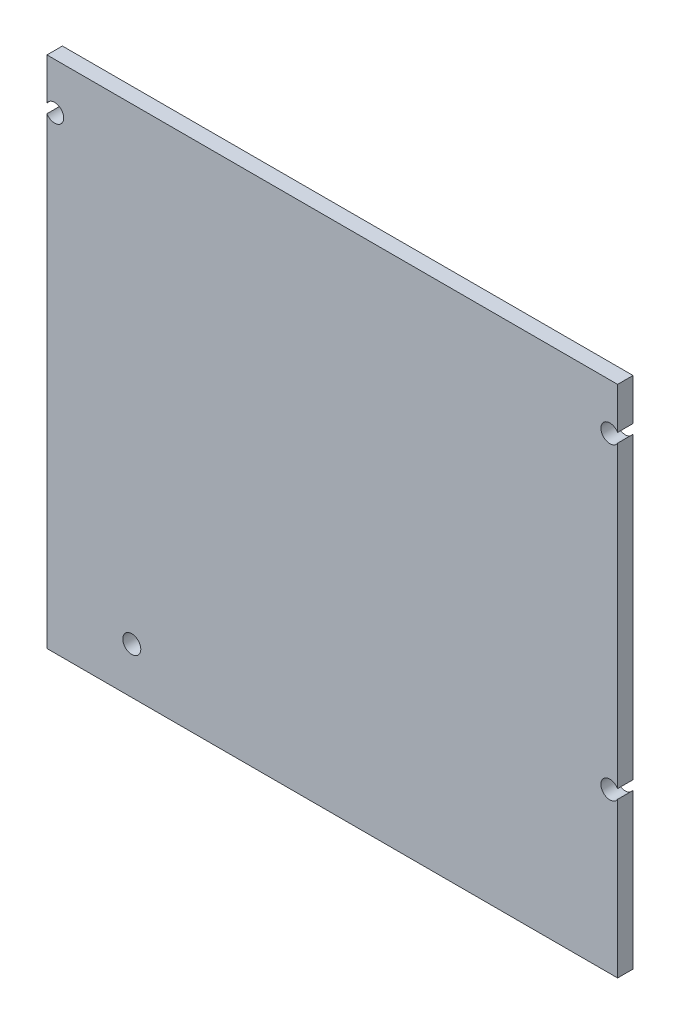
ISO-10303-21;
HEADER;
FILE_DESCRIPTION(('STEP AP214'),'2;1');
FILE_NAME('part.step','',(''),(''),'','','');
FILE_SCHEMA(('AUTOMOTIVE_DESIGN { 1 0 10303 214 1 1 1 1 }'));
ENDSEC;
DATA;
#1=APPLICATION_CONTEXT('core data for automotive mechanical design processes');
#2=APPLICATION_PROTOCOL_DEFINITION('international standard','automotive_design',2000,#1);
#3=PRODUCT_CONTEXT('',#1,'mechanical');
#4=PRODUCT('Part','Part','',(#3));
#5=PRODUCT_RELATED_PRODUCT_CATEGORY('part','',(#4));
#6=PRODUCT_DEFINITION_FORMATION('','',#4);
#7=PRODUCT_DEFINITION_CONTEXT('part definition',#1,'design');
#8=PRODUCT_DEFINITION('design','',#6,#7);
#9=PRODUCT_DEFINITION_SHAPE('','',#8);
#10=(LENGTH_UNIT() NAMED_UNIT(*) SI_UNIT(.MILLI.,.METRE.));
#11=(NAMED_UNIT(*) PLANE_ANGLE_UNIT() SI_UNIT($,.RADIAN.));
#12=(NAMED_UNIT(*) SI_UNIT($,.STERADIAN.) SOLID_ANGLE_UNIT());
#13=UNCERTAINTY_MEASURE_WITH_UNIT(LENGTH_MEASURE(1.E-05),#10,'distance_accuracy_value','');
#14=(GEOMETRIC_REPRESENTATION_CONTEXT(3) GLOBAL_UNCERTAINTY_ASSIGNED_CONTEXT((#13)) GLOBAL_UNIT_ASSIGNED_CONTEXT((#10,
#11,#12)) REPRESENTATION_CONTEXT('',''));
#15=CARTESIAN_POINT('',(0.,0.,0.));
#16=DIRECTION('',(0.,0.,1.));
#17=DIRECTION('',(1.,0.,0.));
#18=AXIS2_PLACEMENT_3D('',#15,#16,#17);
#19=CARTESIAN_POINT('',(1.49999999999993,9.00000000000099,3.));
#20=DIRECTION('',(-1.,0.,0.));
#21=DIRECTION('',(0.,-1.,0.));
#22=AXIS2_PLACEMENT_3D('',#19,#20,#21);
#23=PLANE('',#22);
#24=DIRECTION('',(0.,1.,0.));
#25=VECTOR('',#24,1.);
#26=CARTESIAN_POINT('',(1.49999999999993,9.00000000000099,0.));
#27=LINE('',#26,#25);
#28=CARTESIAN_POINT('',(1.49999999999995,-59.0986121811339,0.));
#29=VERTEX_POINT('',#28);
#30=CARTESIAN_POINT('',(1.49999999999993,-0.901387818866091,0.));
#31=VERTEX_POINT('',#30);
#32=EDGE_CURVE('E128',#29,#31,#27,.T.);
#33=ORIENTED_EDGE('',*,*,#32,.T.);
#34=DIRECTION('',(0.,0.,1.));
#35=VECTOR('',#34,1.);
#36=CARTESIAN_POINT('',(1.49999999999993,-0.901387818866091,3.));
#37=LINE('',#36,#35);
#38=CARTESIAN_POINT('',(1.49999999999993,-0.901387818866089,3.));
#39=VERTEX_POINT('',#38);
#40=EDGE_CURVE('E48',#31,#39,#37,.T.);
#41=ORIENTED_EDGE('',*,*,#40,.T.);
#42=DIRECTION('',(0.,1.,0.));
#43=VECTOR('',#42,1.);
#44=CARTESIAN_POINT('',(1.49999999999993,9.00000000000099,3.));
#45=LINE('',#44,#43);
#46=CARTESIAN_POINT('',(1.49999999999994,-59.0986121811339,3.));
#47=VERTEX_POINT('',#46);
#48=EDGE_CURVE('E170',#47,#39,#45,.T.);
#49=ORIENTED_EDGE('',*,*,#48,.F.);
#50=DIRECTION('',(0.,0.,1.));
#51=VECTOR('',#50,1.);
#52=CARTESIAN_POINT('',(1.49999999999994,-59.0986121811339,3.));
#53=LINE('',#52,#51);
#54=EDGE_CURVE('E133',#47,#29,#53,.F.);
#55=ORIENTED_EDGE('',*,*,#54,.T.);
#56=EDGE_LOOP('',(#33,#41,#49,#55));
#57=FACE_BOUND('',#56,.T.);
#58=ADVANCED_FACE('F33',(#57),#23,.F.);
#59=CARTESIAN_POINT('',(-109.500000000001,9.00000000000099,3.));
#60=DIRECTION('',(1.,0.,0.));
#61=DIRECTION('',(0.,0.,-1.));
#62=AXIS2_PLACEMENT_3D('',#59,#60,#61);
#63=PLANE('',#62);
#64=DIRECTION('',(0.,-1.,0.));
#65=VECTOR('',#64,1.);
#66=CARTESIAN_POINT('',(-109.500000000001,9.00000000000099,0.));
#67=LINE('',#66,#65);
#68=CARTESIAN_POINT('',(-109.500000000001,9.00000000000099,0.));
#69=VERTEX_POINT('',#68);
#70=CARTESIAN_POINT('',(-109.500000000001,0.901387818865084,0.));
#71=VERTEX_POINT('',#70);
#72=EDGE_CURVE('E145',#69,#71,#67,.T.);
#73=ORIENTED_EDGE('',*,*,#72,.T.);
#74=DIRECTION('',(0.,0.,1.));
#75=VECTOR('',#74,1.);
#76=CARTESIAN_POINT('',(-109.500000000001,0.901387818865084,3.));
#77=LINE('',#76,#75);
#78=CARTESIAN_POINT('',(-109.500000000001,0.901387818865078,3.));
#79=VERTEX_POINT('',#78);
#80=EDGE_CURVE('E56',#71,#79,#77,.T.);
#81=ORIENTED_EDGE('',*,*,#80,.T.);
#82=DIRECTION('',(0.,-1.,0.));
#83=VECTOR('',#82,1.);
#84=CARTESIAN_POINT('',(-109.500000000001,9.00000000000099,3.));
#85=LINE('',#84,#83);
#86=CARTESIAN_POINT('',(-109.500000000001,9.00000000000099,3.));
#87=VERTEX_POINT('',#86);
#88=EDGE_CURVE('E167',#87,#79,#85,.T.);
#89=ORIENTED_EDGE('',*,*,#88,.F.);
#90=DIRECTION('',(0.,0.,-1.));
#91=VECTOR('',#90,1.);
#92=CARTESIAN_POINT('',(-109.500000000001,9.00000000000099,3.));
#93=LINE('',#92,#91);
#94=EDGE_CURVE('E157',#87,#69,#93,.T.);
#95=ORIENTED_EDGE('',*,*,#94,.T.);
#96=EDGE_LOOP('',(#73,#81,#89,#95));
#97=FACE_BOUND('',#96,.T.);
#98=ADVANCED_FACE('F212',(#97),#63,.F.);
#99=CARTESIAN_POINT('',(1.49999999999995,-90.9999999999996,0.));
#100=VERTEX_POINT('',#99);
#101=CARTESIAN_POINT('',(1.49999999999995,-60.9013878188661,0.));
#102=VERTEX_POINT('',#101);
#103=EDGE_CURVE('E131',#100,#102,#27,.T.);
#104=ORIENTED_EDGE('',*,*,#103,.T.);
#105=DIRECTION('',(0.,0.,1.));
#106=VECTOR('',#105,1.);
#107=CARTESIAN_POINT('',(1.49999999999995,-60.9013878188661,3.));
#108=LINE('',#107,#106);
#109=CARTESIAN_POINT('',(1.49999999999994,-60.9013878188661,3.));
#110=VERTEX_POINT('',#109);
#111=EDGE_CURVE('E129',#102,#110,#108,.T.);
#112=ORIENTED_EDGE('',*,*,#111,.T.);
#113=CARTESIAN_POINT('',(1.49999999999995,-90.9999999999996,3.));
#114=VERTEX_POINT('',#113);
#115=EDGE_CURVE('E165',#114,#110,#45,.T.);
#116=ORIENTED_EDGE('',*,*,#115,.F.);
#117=DIRECTION('',(0.,0.,-1.));
#118=VECTOR('',#117,1.);
#119=CARTESIAN_POINT('',(1.49999999999995,-90.9999999999996,3.));
#120=LINE('',#119,#118);
#121=EDGE_CURVE('E151',#114,#100,#120,.T.);
#122=ORIENTED_EDGE('',*,*,#121,.T.);
#123=EDGE_LOOP('',(#104,#112,#116,#122));
#124=FACE_BOUND('',#123,.T.);
#125=ADVANCED_FACE('F184',(#124),#23,.F.);
#126=CARTESIAN_POINT('',(1.49999999999993,0.90138781886609,3.));
#127=VERTEX_POINT('',#126);
#128=CARTESIAN_POINT('',(1.49999999999993,9.00000000000099,3.));
#129=VERTEX_POINT('',#128);
#130=EDGE_CURVE('E122',#127,#129,#45,.T.);
#131=ORIENTED_EDGE('',*,*,#130,.F.);
#132=DIRECTION('',(0.,0.,1.));
#133=VECTOR('',#132,1.);
#134=CARTESIAN_POINT('',(1.49999999999993,0.901387818866092,3.));
#135=LINE('',#134,#133);
#136=CARTESIAN_POINT('',(1.49999999999994,0.901387818866094,0.));
#137=VERTEX_POINT('',#136);
#138=EDGE_CURVE('E109',#127,#137,#135,.F.);
#139=ORIENTED_EDGE('',*,*,#138,.T.);
#140=CARTESIAN_POINT('',(1.49999999999993,9.00000000000099,0.));
#141=VERTEX_POINT('',#140);
#142=EDGE_CURVE('E120',#137,#141,#27,.T.);
#143=ORIENTED_EDGE('',*,*,#142,.T.);
#144=DIRECTION('',(0.,0.,-1.));
#145=VECTOR('',#144,1.);
#146=CARTESIAN_POINT('',(1.49999999999993,9.00000000000099,3.));
#147=LINE('',#146,#145);
#148=EDGE_CURVE('E41',#129,#141,#147,.T.);
#149=ORIENTED_EDGE('',*,*,#148,.F.);
#150=EDGE_LOOP('',(#131,#139,#143,#149));
#151=FACE_BOUND('',#150,.T.);
#152=ADVANCED_FACE('F35',(#151),#23,.F.);
#153=CARTESIAN_POINT('',(-109.500000000001,9.00000000000099,3.));
#154=DIRECTION('',(0.,-1.,0.));
#155=DIRECTION('',(0.,0.,-1.));
#156=AXIS2_PLACEMENT_3D('',#153,#154,#155);
#157=PLANE('',#156);
#158=DIRECTION('',(-1.,0.,0.));
#159=VECTOR('',#158,1.);
#160=CARTESIAN_POINT('',(-109.500000000001,9.00000000000099,0.));
#161=LINE('',#160,#159);
#162=EDGE_CURVE('E126',#141,#69,#161,.T.);
#163=ORIENTED_EDGE('',*,*,#162,.T.);
#164=ORIENTED_EDGE('',*,*,#94,.F.);
#165=DIRECTION('',(-1.,0.,0.));
#166=VECTOR('',#165,1.);
#167=CARTESIAN_POINT('',(-109.500000000001,9.00000000000099,3.));
#168=LINE('',#167,#166);
#169=EDGE_CURVE('E160',#129,#87,#168,.T.);
#170=ORIENTED_EDGE('',*,*,#169,.F.);
#171=ORIENTED_EDGE('',*,*,#148,.T.);
#172=EDGE_LOOP('',(#163,#164,#170,#171));
#173=FACE_BOUND('',#172,.T.);
#174=ADVANCED_FACE('F159',(#173),#157,.F.);
#175=CARTESIAN_POINT('',(-109.500000000001,-0.901387818865078,3.));
#176=VERTEX_POINT('',#175);
#177=CARTESIAN_POINT('',(-109.500000000001,-90.9999999999996,3.));
#178=VERTEX_POINT('',#177);
#179=EDGE_CURVE('E164',#176,#178,#85,.T.);
#180=ORIENTED_EDGE('',*,*,#179,.F.);
#181=DIRECTION('',(0.,0.,1.));
#182=VECTOR('',#181,1.);
#183=CARTESIAN_POINT('',(-109.500000000001,-0.901387818865084,3.));
#184=LINE('',#183,#182);
#185=CARTESIAN_POINT('',(-109.500000000001,-0.90138781886509,0.));
#186=VERTEX_POINT('',#185);
#187=EDGE_CURVE('E202',#176,#186,#184,.F.);
#188=ORIENTED_EDGE('',*,*,#187,.T.);
#189=CARTESIAN_POINT('',(-109.500000000001,-90.9999999999996,0.));
#190=VERTEX_POINT('',#189);
#191=EDGE_CURVE('E141',#186,#190,#67,.T.);
#192=ORIENTED_EDGE('',*,*,#191,.T.);
#193=DIRECTION('',(0.,0.,-1.));
#194=VECTOR('',#193,1.);
#195=CARTESIAN_POINT('',(-109.500000000001,-90.9999999999996,3.));
#196=LINE('',#195,#194);
#197=EDGE_CURVE('E153',#178,#190,#196,.T.);
#198=ORIENTED_EDGE('',*,*,#197,.F.);
#199=EDGE_LOOP('',(#180,#188,#192,#198));
#200=FACE_BOUND('',#199,.T.);
#201=ADVANCED_FACE('F218',(#200),#63,.F.);
#202=CARTESIAN_POINT('',(-109.500000000001,-90.9999999999996,3.));
#203=DIRECTION('',(0.,1.,0.));
#204=DIRECTION('',(0.,0.,1.));
#205=AXIS2_PLACEMENT_3D('',#202,#203,#204);
#206=PLANE('',#205);
#207=DIRECTION('',(1.,0.,0.));
#208=VECTOR('',#207,1.);
#209=CARTESIAN_POINT('',(-109.500000000001,-90.9999999999996,0.));
#210=LINE('',#209,#208);
#211=EDGE_CURVE('E149',#190,#100,#210,.T.);
#212=ORIENTED_EDGE('',*,*,#211,.T.);
#213=ORIENTED_EDGE('',*,*,#121,.F.);
#214=DIRECTION('',(1.,0.,0.));
#215=VECTOR('',#214,1.);
#216=CARTESIAN_POINT('',(-109.500000000001,-90.9999999999996,3.));
#217=LINE('',#216,#215);
#218=EDGE_CURVE('E154',#178,#114,#217,.T.);
#219=ORIENTED_EDGE('',*,*,#218,.F.);
#220=ORIENTED_EDGE('',*,*,#197,.T.);
#221=EDGE_LOOP('',(#212,#213,#219,#220));
#222=FACE_BOUND('',#221,.T.);
#223=ADVANCED_FACE('F182',(#222),#206,.F.);
#224=CARTESIAN_POINT('',(0.,0.,3.));
#225=DIRECTION('',(0.,0.,1.));
#226=DIRECTION('',(1.,0.,0.));
#227=AXIS2_PLACEMENT_3D('',#224,#225,#226);
#228=PLANE('',#227);
#229=CARTESIAN_POINT('',(0.,0.,3.));
#230=DIRECTION('',(0.,0.,1.));
#231=DIRECTION('',(1.,0.,0.));
#232=AXIS2_PLACEMENT_3D('',#229,#230,#231);
#233=CIRCLE('',#232,1.74999999999999);
#234=EDGE_CURVE('E115',#127,#39,#233,.T.);
#235=ORIENTED_EDGE('',*,*,#234,.F.);
#236=ORIENTED_EDGE('',*,*,#130,.T.);
#237=ORIENTED_EDGE('',*,*,#169,.T.);
#238=ORIENTED_EDGE('',*,*,#88,.T.);
#239=CARTESIAN_POINT('',(-108.,0.,3.));
#240=DIRECTION('',(0.,0.,1.));
#241=DIRECTION('',(1.,0.,0.));
#242=AXIS2_PLACEMENT_3D('',#239,#240,#241);
#243=CIRCLE('',#242,1.74999999999999);
#244=EDGE_CURVE('E205',#176,#79,#243,.T.);
#245=ORIENTED_EDGE('',*,*,#244,.F.);
#246=ORIENTED_EDGE('',*,*,#179,.T.);
#247=ORIENTED_EDGE('',*,*,#218,.T.);
#248=ORIENTED_EDGE('',*,*,#115,.T.);
#249=CARTESIAN_POINT('',(0.,-60.,3.));
#250=DIRECTION('',(0.,0.,1.));
#251=DIRECTION('',(1.,0.,0.));
#252=AXIS2_PLACEMENT_3D('',#249,#250,#251);
#253=CIRCLE('',#252,1.74999999999999);
#254=EDGE_CURVE('E190',#47,#110,#253,.T.);
#255=ORIENTED_EDGE('',*,*,#254,.F.);
#256=ORIENTED_EDGE('',*,*,#48,.T.);
#257=EDGE_LOOP('',(#235,#236,#237,#238,#245,#246,#247,#248,#255,#256));
#258=FACE_BOUND('',#257,.T.);
#259=CARTESIAN_POINT('',(-93.,-82.,3.));
#260=DIRECTION('',(0.,0.,1.));
#261=DIRECTION('',(1.,0.,0.));
#262=AXIS2_PLACEMENT_3D('',#259,#260,#261);
#263=CIRCLE('',#262,1.74999999999999);
#264=CARTESIAN_POINT('',(-91.25,-82.,3.));
#265=VERTEX_POINT('',#264);
#266=EDGE_CURVE('E198',#265,#265,#263,.T.);
#267=ORIENTED_EDGE('',*,*,#266,.F.);
#268=EDGE_LOOP('',(#267));
#269=FACE_BOUND('',#268,.T.);
#270=ADVANCED_FACE('F174',(#258,#269),#228,.T.);
#271=CARTESIAN_POINT('',(0.,0.,0.));
#272=DIRECTION('',(0.,0.,1.));
#273=DIRECTION('',(1.,0.,0.));
#274=AXIS2_PLACEMENT_3D('',#271,#272,#273);
#275=PLANE('',#274);
#276=CARTESIAN_POINT('',(-93.,-82.,0.));
#277=DIRECTION('',(0.,0.,1.));
#278=DIRECTION('',(1.,0.,0.));
#279=AXIS2_PLACEMENT_3D('',#276,#277,#278);
#280=CIRCLE('',#279,1.75);
#281=CARTESIAN_POINT('',(-91.25,-82.,0.));
#282=VERTEX_POINT('',#281);
#283=EDGE_CURVE('E193',#282,#282,#280,.T.);
#284=ORIENTED_EDGE('',*,*,#283,.T.);
#285=EDGE_LOOP('',(#284));
#286=FACE_BOUND('',#285,.T.);
#287=ORIENTED_EDGE('',*,*,#142,.F.);
#288=CARTESIAN_POINT('',(0.,0.,0.));
#289=DIRECTION('',(0.,0.,1.));
#290=DIRECTION('',(1.,0.,0.));
#291=AXIS2_PLACEMENT_3D('',#288,#289,#290);
#292=CIRCLE('',#291,1.75);
#293=EDGE_CURVE('E106',#137,#31,#292,.T.);
#294=ORIENTED_EDGE('',*,*,#293,.T.);
#295=ORIENTED_EDGE('',*,*,#32,.F.);
#296=CARTESIAN_POINT('',(0.,-60.,0.));
#297=DIRECTION('',(0.,0.,1.));
#298=DIRECTION('',(1.,0.,0.));
#299=AXIS2_PLACEMENT_3D('',#296,#297,#298);
#300=CIRCLE('',#299,1.75);
#301=EDGE_CURVE('E188',#29,#102,#300,.T.);
#302=ORIENTED_EDGE('',*,*,#301,.T.);
#303=ORIENTED_EDGE('',*,*,#103,.F.);
#304=ORIENTED_EDGE('',*,*,#211,.F.);
#305=ORIENTED_EDGE('',*,*,#191,.F.);
#306=CARTESIAN_POINT('',(-108.,0.,0.));
#307=DIRECTION('',(0.,0.,1.));
#308=DIRECTION('',(1.,0.,0.));
#309=AXIS2_PLACEMENT_3D('',#306,#307,#308);
#310=CIRCLE('',#309,1.74999999999999);
#311=EDGE_CURVE('E11',#186,#71,#310,.T.);
#312=ORIENTED_EDGE('',*,*,#311,.T.);
#313=ORIENTED_EDGE('',*,*,#72,.F.);
#314=ORIENTED_EDGE('',*,*,#162,.F.);
#315=EDGE_LOOP('',(#287,#294,#295,#302,#303,#304,#305,#312,#313,#314));
#316=FACE_BOUND('',#315,.T.);
#317=ADVANCED_FACE('F124',(#286,#316),#275,.F.);
#318=CARTESIAN_POINT('',(0.,-60.,3.));
#319=DIRECTION('',(0.,0.,1.));
#320=DIRECTION('',(1.,0.,0.));
#321=AXIS2_PLACEMENT_3D('',#318,#319,#320);
#322=CYLINDRICAL_SURFACE('',#321,1.74999999999999);
#323=ORIENTED_EDGE('',*,*,#301,.F.);
#324=ORIENTED_EDGE('',*,*,#54,.F.);
#325=ORIENTED_EDGE('',*,*,#254,.T.);
#326=ORIENTED_EDGE('',*,*,#111,.F.);
#327=EDGE_LOOP('',(#323,#324,#325,#326));
#328=FACE_BOUND('',#327,.T.);
#329=ADVANCED_FACE('F187',(#328),#322,.F.);
#330=CARTESIAN_POINT('',(-93.,-82.,3.));
#331=DIRECTION('',(0.,0.,1.));
#332=DIRECTION('',(1.,0.,0.));
#333=AXIS2_PLACEMENT_3D('',#330,#331,#332);
#334=CYLINDRICAL_SURFACE('',#333,1.74999999999999);
#335=ORIENTED_EDGE('',*,*,#283,.F.);
#336=EDGE_LOOP('',(#335));
#337=FACE_BOUND('',#336,.T.);
#338=ORIENTED_EDGE('',*,*,#266,.T.);
#339=EDGE_LOOP('',(#338));
#340=FACE_BOUND('',#339,.T.);
#341=ADVANCED_FACE('F238',(#337,#340),#334,.F.);
#342=CARTESIAN_POINT('',(-108.,0.,3.));
#343=DIRECTION('',(0.,0.,1.));
#344=DIRECTION('',(1.,0.,0.));
#345=AXIS2_PLACEMENT_3D('',#342,#343,#344);
#346=CYLINDRICAL_SURFACE('',#345,1.74999999999999);
#347=ORIENTED_EDGE('',*,*,#311,.F.);
#348=ORIENTED_EDGE('',*,*,#187,.F.);
#349=ORIENTED_EDGE('',*,*,#244,.T.);
#350=ORIENTED_EDGE('',*,*,#80,.F.);
#351=EDGE_LOOP('',(#347,#348,#349,#350));
#352=FACE_BOUND('',#351,.T.);
#353=ADVANCED_FACE('F241',(#352),#346,.F.);
#354=CARTESIAN_POINT('',(0.,0.,3.));
#355=DIRECTION('',(0.,0.,1.));
#356=DIRECTION('',(1.,0.,0.));
#357=AXIS2_PLACEMENT_3D('',#354,#355,#356);
#358=CYLINDRICAL_SURFACE('',#357,1.74999999999999);
#359=ORIENTED_EDGE('',*,*,#293,.F.);
#360=ORIENTED_EDGE('',*,*,#138,.F.);
#361=ORIENTED_EDGE('',*,*,#234,.T.);
#362=ORIENTED_EDGE('',*,*,#40,.F.);
#363=EDGE_LOOP('',(#359,#360,#361,#362));
#364=FACE_BOUND('',#363,.T.);
#365=ADVANCED_FACE('F108',(#364),#358,.F.);
#366=CLOSED_SHELL('',(#58,#98,#125,#152,#174,#201,#223,#270,#317,#329,#341,#353,#365));
#367=MANIFOLD_SOLID_BREP('B2',#366);
#368=ADVANCED_BREP_SHAPE_REPRESENTATION('',(#18,#367),#14);
#369=SHAPE_DEFINITION_REPRESENTATION(#9,#368);
ENDSEC;
END-ISO-10303-21;
